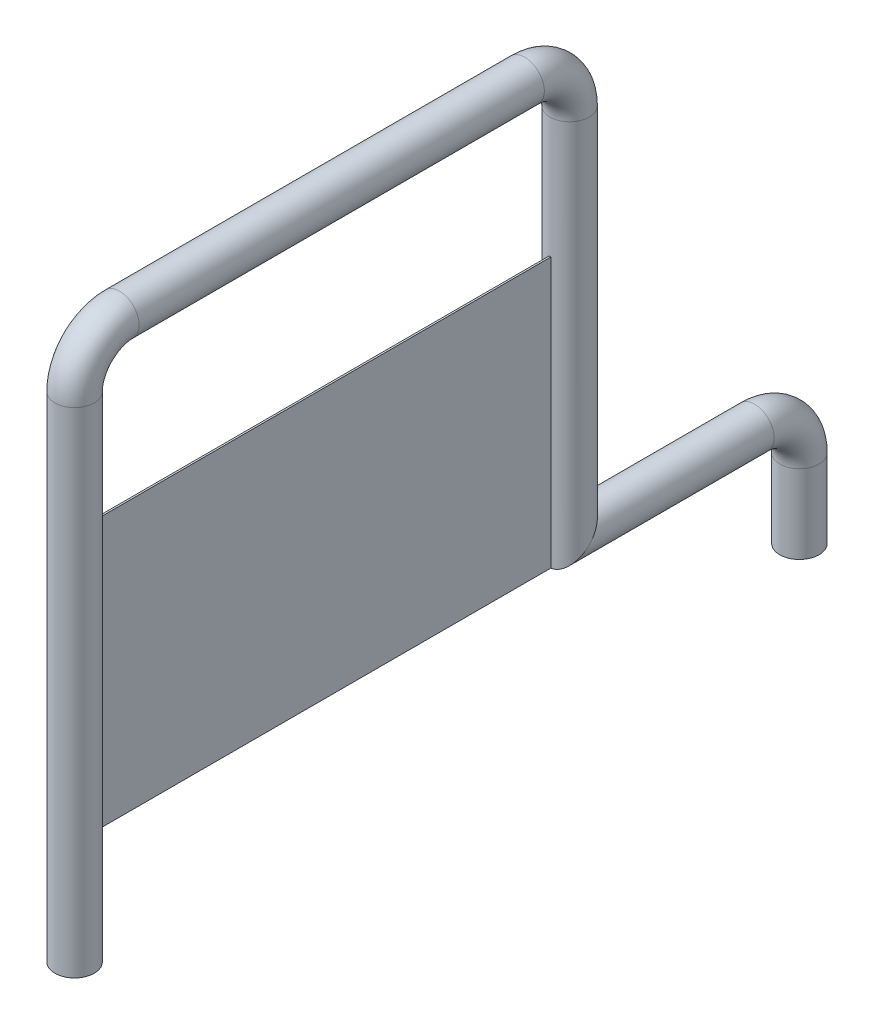
ISO-10303-21;
HEADER;
FILE_DESCRIPTION(('STEP AP214'),'2;1');
FILE_NAME('part.step','',(''),(''),'','','');
FILE_SCHEMA(('AUTOMOTIVE_DESIGN { 1 0 10303 214 1 1 1 1 }'));
ENDSEC;
DATA;
#1=APPLICATION_CONTEXT('core data for automotive mechanical design processes');
#2=APPLICATION_PROTOCOL_DEFINITION('international standard','automotive_design',2000,#1);
#3=PRODUCT_CONTEXT('',#1,'mechanical');
#4=PRODUCT('Part','Part','',(#3));
#5=PRODUCT_RELATED_PRODUCT_CATEGORY('part','',(#4));
#6=PRODUCT_DEFINITION_FORMATION('','',#4);
#7=PRODUCT_DEFINITION_CONTEXT('part definition',#1,'design');
#8=PRODUCT_DEFINITION('design','',#6,#7);
#9=PRODUCT_DEFINITION_SHAPE('','',#8);
#10=(LENGTH_UNIT() NAMED_UNIT(*) SI_UNIT(.MILLI.,.METRE.));
#11=(NAMED_UNIT(*) PLANE_ANGLE_UNIT() SI_UNIT($,.RADIAN.));
#12=(NAMED_UNIT(*) SI_UNIT($,.STERADIAN.) SOLID_ANGLE_UNIT());
#13=UNCERTAINTY_MEASURE_WITH_UNIT(LENGTH_MEASURE(1.E-05),#10,'distance_accuracy_value','');
#14=(GEOMETRIC_REPRESENTATION_CONTEXT(3) GLOBAL_UNCERTAINTY_ASSIGNED_CONTEXT((#13)) GLOBAL_UNIT_ASSIGNED_CONTEXT((#10,
#11,#12)) REPRESENTATION_CONTEXT('',''));
#15=CARTESIAN_POINT('',(0.,0.,0.));
#16=DIRECTION('',(0.,0.,1.));
#17=DIRECTION('',(1.,0.,0.));
#18=AXIS2_PLACEMENT_3D('',#15,#16,#17);
#19=CARTESIAN_POINT('',(-0.508,211.1375,-268.8875));
#20=DIRECTION('',(0.,1.,0.));
#21=DIRECTION('',(0.,0.,1.));
#22=AXIS2_PLACEMENT_3D('',#19,#20,#21);
#23=PLANE('',#22);
#24=DIRECTION('',(1.,0.,0.));
#25=VECTOR('',#24,1.);
#26=CARTESIAN_POINT('',(-0.508,211.1375,-11.1125));
#27=LINE('',#26,#25);
#28=CARTESIAN_POINT('',(-0.508,211.1375,-11.1125));
#29=VERTEX_POINT('',#28);
#30=CARTESIAN_POINT('',(0.508,211.1375,-11.1125));
#31=VERTEX_POINT('',#30);
#32=EDGE_CURVE('E45',#29,#31,#27,.T.);
#33=ORIENTED_EDGE('',*,*,#32,.T.);
#34=DIRECTION('',(0.,0.,1.));
#35=VECTOR('',#34,1.);
#36=CARTESIAN_POINT('',(0.508,211.1375,-268.8875));
#37=LINE('',#36,#35);
#38=CARTESIAN_POINT('',(0.508,211.1375,-268.8875));
#39=VERTEX_POINT('',#38);
#40=EDGE_CURVE('E82',#39,#31,#37,.T.);
#41=ORIENTED_EDGE('',*,*,#40,.F.);
#42=DIRECTION('',(1.,0.,0.));
#43=VECTOR('',#42,1.);
#44=CARTESIAN_POINT('',(-0.508,211.1375,-268.8875));
#45=LINE('',#44,#43);
#46=CARTESIAN_POINT('',(-0.508,211.1375,-268.8875));
#47=VERTEX_POINT('',#46);
#48=EDGE_CURVE('E13',#47,#39,#45,.T.);
#49=ORIENTED_EDGE('',*,*,#48,.F.);
#50=DIRECTION('',(0.,0.,1.));
#51=VECTOR('',#50,1.);
#52=CARTESIAN_POINT('',(-0.508,211.1375,-268.8875));
#53=LINE('',#52,#51);
#54=EDGE_CURVE('E83',#47,#29,#53,.T.);
#55=ORIENTED_EDGE('',*,*,#54,.T.);
#56=EDGE_LOOP('',(#33,#41,#49,#55));
#57=FACE_BOUND('',#56,.T.);
#58=ADVANCED_FACE('F42',(#57),#23,.T.);
#59=CARTESIAN_POINT('',(-0.508,211.1375,-268.8875));
#60=DIRECTION('',(0.,0.,-1.));
#61=DIRECTION('',(0.,1.,0.));
#62=AXIS2_PLACEMENT_3D('',#59,#60,#61);
#63=PLANE('',#62);
#64=ORIENTED_EDGE('',*,*,#48,.T.);
#65=DIRECTION('',(0.,1.,0.));
#66=VECTOR('',#65,1.);
#67=CARTESIAN_POINT('',(0.508,211.1375,-268.8875));
#68=LINE('',#67,#66);
#69=CARTESIAN_POINT('',(0.508,58.7374999999999,-268.8875));
#70=VERTEX_POINT('',#69);
#71=EDGE_CURVE('E99',#70,#39,#68,.T.);
#72=ORIENTED_EDGE('',*,*,#71,.F.);
#73=DIRECTION('',(1.,0.,0.));
#74=VECTOR('',#73,1.);
#75=CARTESIAN_POINT('',(-0.508,58.7374999999999,-268.8875));
#76=LINE('',#75,#74);
#77=CARTESIAN_POINT('',(-0.508,58.7374999999999,-268.8875));
#78=VERTEX_POINT('',#77);
#79=EDGE_CURVE('E50',#78,#70,#76,.T.);
#80=ORIENTED_EDGE('',*,*,#79,.F.);
#81=DIRECTION('',(0.,1.,0.));
#82=VECTOR('',#81,1.);
#83=CARTESIAN_POINT('',(-0.508,211.1375,-268.8875));
#84=LINE('',#83,#82);
#85=EDGE_CURVE('E88',#78,#47,#84,.T.);
#86=ORIENTED_EDGE('',*,*,#85,.T.);
#87=EDGE_LOOP('',(#64,#72,#80,#86));
#88=FACE_BOUND('',#87,.T.);
#89=ADVANCED_FACE('F114',(#88),#63,.T.);
#90=CARTESIAN_POINT('',(-0.508,58.7374999999999,-268.8875));
#91=DIRECTION('',(0.,-1.,0.));
#92=DIRECTION('',(0.,0.,-1.));
#93=AXIS2_PLACEMENT_3D('',#90,#91,#92);
#94=PLANE('',#93);
#95=ORIENTED_EDGE('',*,*,#79,.T.);
#96=DIRECTION('',(0.,0.,-1.));
#97=VECTOR('',#96,1.);
#98=CARTESIAN_POINT('',(0.508,58.7374999999999,-268.8875));
#99=LINE('',#98,#97);
#100=CARTESIAN_POINT('',(0.508,58.7374999999998,-11.1125));
#101=VERTEX_POINT('',#100);
#102=EDGE_CURVE('E95',#101,#70,#99,.T.);
#103=ORIENTED_EDGE('',*,*,#102,.F.);
#104=DIRECTION('',(1.,0.,0.));
#105=VECTOR('',#104,1.);
#106=CARTESIAN_POINT('',(-0.508,58.7374999999998,-11.1125));
#107=LINE('',#106,#105);
#108=CARTESIAN_POINT('',(-0.508,58.7374999999998,-11.1125));
#109=VERTEX_POINT('',#108);
#110=EDGE_CURVE('E87',#109,#101,#107,.T.);
#111=ORIENTED_EDGE('',*,*,#110,.F.);
#112=DIRECTION('',(0.,0.,-1.));
#113=VECTOR('',#112,1.);
#114=CARTESIAN_POINT('',(-0.508,58.7374999999999,-268.8875));
#115=LINE('',#114,#113);
#116=EDGE_CURVE('E107',#109,#78,#115,.T.);
#117=ORIENTED_EDGE('',*,*,#116,.T.);
#118=EDGE_LOOP('',(#95,#103,#111,#117));
#119=FACE_BOUND('',#118,.T.);
#120=ADVANCED_FACE('F111',(#119),#94,.T.);
#121=CARTESIAN_POINT('',(-0.508,211.1375,-11.1125));
#122=DIRECTION('',(0.,0.,1.));
#123=DIRECTION('',(1.,0.,0.));
#124=AXIS2_PLACEMENT_3D('',#121,#122,#123);
#125=PLANE('',#124);
#126=ORIENTED_EDGE('',*,*,#110,.T.);
#127=DIRECTION('',(0.,-1.,0.));
#128=VECTOR('',#127,1.);
#129=CARTESIAN_POINT('',(0.508,211.1375,-11.1125));
#130=LINE('',#129,#128);
#131=EDGE_CURVE('E90',#31,#101,#130,.T.);
#132=ORIENTED_EDGE('',*,*,#131,.F.);
#133=ORIENTED_EDGE('',*,*,#32,.F.);
#134=DIRECTION('',(0.,-1.,0.));
#135=VECTOR('',#134,1.);
#136=CARTESIAN_POINT('',(-0.508,211.1375,-11.1125));
#137=LINE('',#136,#135);
#138=EDGE_CURVE('E105',#29,#109,#137,.T.);
#139=ORIENTED_EDGE('',*,*,#138,.T.);
#140=EDGE_LOOP('',(#126,#132,#133,#139));
#141=FACE_BOUND('',#140,.T.);
#142=ADVANCED_FACE('F91',(#141),#125,.T.);
#143=CARTESIAN_POINT('',(-0.508,211.1375,-11.1125));
#144=DIRECTION('',(1.,0.,0.));
#145=DIRECTION('',(0.,0.,-1.));
#146=AXIS2_PLACEMENT_3D('',#143,#144,#145);
#147=PLANE('',#146);
#148=ORIENTED_EDGE('',*,*,#54,.F.);
#149=ORIENTED_EDGE('',*,*,#85,.F.);
#150=ORIENTED_EDGE('',*,*,#116,.F.);
#151=ORIENTED_EDGE('',*,*,#138,.F.);
#152=EDGE_LOOP('',(#148,#149,#150,#151));
#153=FACE_BOUND('',#152,.T.);
#154=ADVANCED_FACE('F116',(#153),#147,.F.);
#155=CARTESIAN_POINT('',(0.508,211.1375,-11.1125));
#156=DIRECTION('',(1.,0.,0.));
#157=DIRECTION('',(0.,0.,-1.));
#158=AXIS2_PLACEMENT_3D('',#155,#156,#157);
#159=PLANE('',#158);
#160=ORIENTED_EDGE('',*,*,#40,.T.);
#161=ORIENTED_EDGE('',*,*,#131,.T.);
#162=ORIENTED_EDGE('',*,*,#102,.T.);
#163=ORIENTED_EDGE('',*,*,#71,.T.);
#164=EDGE_LOOP('',(#160,#161,#162,#163));
#165=FACE_BOUND('',#164,.T.);
#166=ADVANCED_FACE('F98',(#165),#159,.T.);
#167=CLOSED_SHELL('',(#58,#89,#120,#142,#154,#166));
#168=MANIFOLD_SOLID_BREP('B2',#167);
#169=CARTESIAN_POINT('',(0.,44.4499999999999,-410.));
#170=DIRECTION('',(0.,-1.,0.));
#171=DIRECTION('',(0.,0.,-1.));
#172=AXIS2_PLACEMENT_3D('',#169,#170,#171);
#173=CYLINDRICAL_SURFACE('',#172,11.1125);
#174=CARTESIAN_POINT('',(0.,44.4499999999999,-410.));
#175=DIRECTION('',(0.,-1.,0.));
#176=DIRECTION('',(0.,0.,-1.));
#177=AXIS2_PLACEMENT_3D('',#174,#175,#176);
#178=CIRCLE('',#177,11.1125);
#179=CARTESIAN_POINT('',(0.,44.4499999999999,-421.1125));
#180=VERTEX_POINT('',#179);
#181=EDGE_CURVE('E171',#180,#180,#178,.T.);
#182=ORIENTED_EDGE('',*,*,#181,.T.);
#183=EDGE_LOOP('',(#182));
#184=FACE_BOUND('',#183,.T.);
#185=CARTESIAN_POINT('',(0.,0.,-410.));
#186=DIRECTION('',(0.,-1.,0.));
#187=DIRECTION('',(0.,0.,-1.));
#188=AXIS2_PLACEMENT_3D('',#185,#186,#187);
#189=CIRCLE('',#188,11.1125);
#190=CARTESIAN_POINT('',(0.,0.,-421.1125));
#191=VERTEX_POINT('',#190);
#192=EDGE_CURVE('E41',#191,#191,#189,.T.);
#193=ORIENTED_EDGE('',*,*,#192,.F.);
#194=EDGE_LOOP('',(#193));
#195=FACE_BOUND('',#194,.T.);
#196=ADVANCED_FACE('F165',(#184,#195),#173,.T.);
#197=CARTESIAN_POINT('',(0.,44.4499999999999,-384.6));
#198=DIRECTION('',(-1.,0.,0.));
#199=DIRECTION('',(0.,0.,1.));
#200=AXIS2_PLACEMENT_3D('',#197,#198,#199);
#201=TOROIDAL_SURFACE('',#200,25.4,11.1125);
#202=CARTESIAN_POINT('',(0.,69.8499999999999,-384.6));
#203=DIRECTION('',(0.,0.,-1.));
#204=DIRECTION('',(0.,1.,0.));
#205=AXIS2_PLACEMENT_3D('',#202,#203,#204);
#206=CIRCLE('',#205,11.1125);
#207=CARTESIAN_POINT('',(0.,80.9624999999999,-384.6));
#208=VERTEX_POINT('',#207);
#209=EDGE_CURVE('E175',#208,#208,#206,.T.);
#210=CARTESIAN_POINT('',(0.,44.4499999999999,-384.6));
#211=DIRECTION('',(-1.,0.,0.));
#212=DIRECTION('',(0.,0.,1.));
#213=AXIS2_PLACEMENT_3D('',#210,#211,#212);
#214=CIRCLE('',#213,36.5125);
#215=EDGE_CURVE('',#208,#180,#214,.T.);
#216=ORIENTED_EDGE('',*,*,#209,.T.);
#217=ORIENTED_EDGE('',*,*,#181,.F.);
#218=ORIENTED_EDGE('',*,*,#215,.T.);
#219=ORIENTED_EDGE('',*,*,#215,.F.);
#220=EDGE_LOOP('',(#216,#218,#217,#219));
#221=FACE_BOUND('',#220,.T.);
#222=ADVANCED_FACE('F218',(#221),#201,.T.);
#223=CARTESIAN_POINT('',(0.,69.8499999999999,-280.));
#224=DIRECTION('',(0.,0.,-1.));
#225=DIRECTION('',(-1.,0.,0.));
#226=AXIS2_PLACEMENT_3D('',#223,#224,#225);
#227=CYLINDRICAL_SURFACE('',#226,11.1125);
#228=CARTESIAN_POINT('',(0.,69.8499999999999,-280.));
#229=DIRECTION('',(0.,-0.707106781186548,-0.707106781186548));
#230=DIRECTION('',(0.,-0.707106781186548,0.707106781186548));
#231=AXIS2_PLACEMENT_3D('',#228,#229,#230);
#232=ELLIPSE('',#231,15.715448211871,11.1125);
#233=CARTESIAN_POINT('',(0.,58.7374999999999,-268.8875));
#234=VERTEX_POINT('',#233);
#235=EDGE_CURVE('E179',#234,#234,#232,.F.);
#236=ORIENTED_EDGE('',*,*,#235,.F.);
#237=EDGE_LOOP('',(#236));
#238=FACE_BOUND('',#237,.T.);
#239=ORIENTED_EDGE('',*,*,#209,.F.);
#240=EDGE_LOOP('',(#239));
#241=FACE_BOUND('',#240,.T.);
#242=ADVANCED_FACE('F222',(#238,#241),#227,.T.);
#243=CARTESIAN_POINT('',(0.,279.4,-280.));
#244=DIRECTION('',(0.,-1.,0.));
#245=DIRECTION('',(0.,0.,-1.));
#246=AXIS2_PLACEMENT_3D('',#243,#244,#245);
#247=CYLINDRICAL_SURFACE('',#246,11.1125);
#248=ORIENTED_EDGE('',*,*,#235,.T.);
#249=EDGE_LOOP('',(#248));
#250=FACE_BOUND('',#249,.T.);
#251=CARTESIAN_POINT('',(0.,279.4,-280.));
#252=DIRECTION('',(0.,-1.,0.));
#253=DIRECTION('',(0.,0.,-1.));
#254=AXIS2_PLACEMENT_3D('',#251,#252,#253);
#255=CIRCLE('',#254,11.1125);
#256=CARTESIAN_POINT('',(0.,279.4,-291.1125));
#257=VERTEX_POINT('',#256);
#258=EDGE_CURVE('E184',#257,#257,#255,.T.);
#259=ORIENTED_EDGE('',*,*,#258,.T.);
#260=EDGE_LOOP('',(#259));
#261=FACE_BOUND('',#260,.T.);
#262=ADVANCED_FACE('F228',(#250,#261),#247,.T.);
#263=CARTESIAN_POINT('',(0.,279.4,-254.6));
#264=DIRECTION('',(-1.,0.,0.));
#265=DIRECTION('',(0.,0.,1.));
#266=AXIS2_PLACEMENT_3D('',#263,#264,#265);
#267=TOROIDAL_SURFACE('',#266,25.4,11.1125);
#268=CARTESIAN_POINT('',(0.,304.8,-254.6));
#269=DIRECTION('',(0.,0.,-1.));
#270=DIRECTION('',(0.,1.,0.));
#271=AXIS2_PLACEMENT_3D('',#268,#269,#270);
#272=CIRCLE('',#271,11.1125);
#273=CARTESIAN_POINT('',(0.,315.9125,-254.6));
#274=VERTEX_POINT('',#273);
#275=EDGE_CURVE('E187',#274,#274,#272,.T.);
#276=CARTESIAN_POINT('',(0.,279.4,-254.6));
#277=DIRECTION('',(-1.,0.,0.));
#278=DIRECTION('',(0.,0.,1.));
#279=AXIS2_PLACEMENT_3D('',#276,#277,#278);
#280=CIRCLE('',#279,36.5125);
#281=EDGE_CURVE('',#274,#257,#280,.T.);
#282=ORIENTED_EDGE('',*,*,#275,.T.);
#283=ORIENTED_EDGE('',*,*,#258,.F.);
#284=ORIENTED_EDGE('',*,*,#281,.T.);
#285=ORIENTED_EDGE('',*,*,#281,.F.);
#286=EDGE_LOOP('',(#282,#284,#283,#285));
#287=FACE_BOUND('',#286,.T.);
#288=ADVANCED_FACE('F235',(#287),#267,.T.);
#289=CARTESIAN_POINT('',(0.,304.8,-25.4000000000002));
#290=DIRECTION('',(0.,0.,-1.));
#291=DIRECTION('',(0.,1.,0.));
#292=AXIS2_PLACEMENT_3D('',#289,#290,#291);
#293=CYLINDRICAL_SURFACE('',#292,11.1125);
#294=CARTESIAN_POINT('',(0.,304.8,-25.4000000000002));
#295=DIRECTION('',(0.,0.,-1.));
#296=DIRECTION('',(0.,1.,0.));
#297=AXIS2_PLACEMENT_3D('',#294,#295,#296);
#298=CIRCLE('',#297,11.1125);
#299=CARTESIAN_POINT('',(0.,315.9125,-25.4000000000003));
#300=VERTEX_POINT('',#299);
#301=EDGE_CURVE('E190',#300,#300,#298,.T.);
#302=ORIENTED_EDGE('',*,*,#301,.T.);
#303=EDGE_LOOP('',(#302));
#304=FACE_BOUND('',#303,.T.);
#305=ORIENTED_EDGE('',*,*,#275,.F.);
#306=EDGE_LOOP('',(#305));
#307=FACE_BOUND('',#306,.T.);
#308=ADVANCED_FACE('F239',(#304,#307),#293,.T.);
#309=CARTESIAN_POINT('',(0.,279.4,-25.4));
#310=DIRECTION('',(-1.,0.,0.));
#311=DIRECTION('',(0.,0.,1.));
#312=AXIS2_PLACEMENT_3D('',#309,#310,#311);
#313=TOROIDAL_SURFACE('',#312,25.4,11.1125);
#314=CARTESIAN_POINT('',(0.,279.4,0.));
#315=DIRECTION('',(0.,1.,0.));
#316=DIRECTION('',(0.,0.,1.));
#317=AXIS2_PLACEMENT_3D('',#314,#315,#316);
#318=CIRCLE('',#317,11.1125);
#319=CARTESIAN_POINT('',(0.,279.4,11.1125));
#320=VERTEX_POINT('',#319);
#321=EDGE_CURVE('E193',#320,#320,#318,.T.);
#322=CARTESIAN_POINT('',(0.,279.4,-25.4));
#323=DIRECTION('',(-1.,0.,0.));
#324=DIRECTION('',(0.,0.,1.));
#325=AXIS2_PLACEMENT_3D('',#322,#323,#324);
#326=CIRCLE('',#325,36.5125);
#327=EDGE_CURVE('',#320,#300,#326,.T.);
#328=ORIENTED_EDGE('',*,*,#321,.T.);
#329=ORIENTED_EDGE('',*,*,#301,.F.);
#330=ORIENTED_EDGE('',*,*,#327,.T.);
#331=ORIENTED_EDGE('',*,*,#327,.F.);
#332=EDGE_LOOP('',(#328,#330,#329,#331));
#333=FACE_BOUND('',#332,.T.);
#334=ADVANCED_FACE('F200',(#333),#313,.T.);
#335=CARTESIAN_POINT('',(0.,279.4,0.));
#336=DIRECTION('',(0.,-1.,0.));
#337=DIRECTION('',(0.,0.,-1.));
#338=AXIS2_PLACEMENT_3D('',#335,#336,#337);
#339=CYLINDRICAL_SURFACE('',#338,11.1125);
#340=ORIENTED_EDGE('',*,*,#321,.F.);
#341=EDGE_LOOP('',(#340));
#342=FACE_BOUND('',#341,.T.);
#343=CARTESIAN_POINT('',(0.,0.,0.));
#344=DIRECTION('',(0.,1.,0.));
#345=DIRECTION('',(0.,0.,1.));
#346=AXIS2_PLACEMENT_3D('',#343,#344,#345);
#347=CIRCLE('',#346,11.1125);
#348=CARTESIAN_POINT('',(0.,0.,11.1125));
#349=VERTEX_POINT('',#348);
#350=EDGE_CURVE('E194',#349,#349,#347,.T.);
#351=ORIENTED_EDGE('',*,*,#350,.T.);
#352=EDGE_LOOP('',(#351));
#353=FACE_BOUND('',#352,.T.);
#354=ADVANCED_FACE('F203',(#342,#353),#339,.T.);
#355=CARTESIAN_POINT('',(0.,0.,0.));
#356=DIRECTION('',(0.,1.,0.));
#357=DIRECTION('',(0.,0.,1.));
#358=AXIS2_PLACEMENT_3D('',#355,#356,#357);
#359=PLANE('',#358);
#360=ORIENTED_EDGE('',*,*,#350,.F.);
#361=EDGE_LOOP('',(#360));
#362=FACE_BOUND('',#361,.T.);
#363=ADVANCED_FACE('F206',(#362),#359,.F.);
#364=CARTESIAN_POINT('',(0.,0.,-410.));
#365=DIRECTION('',(0.,-1.,0.));
#366=DIRECTION('',(0.,0.,-1.));
#367=AXIS2_PLACEMENT_3D('',#364,#365,#366);
#368=PLANE('',#367);
#369=ORIENTED_EDGE('',*,*,#192,.T.);
#370=EDGE_LOOP('',(#369));
#371=FACE_BOUND('',#370,.T.);
#372=ADVANCED_FACE('F211',(#371),#368,.T.);
#373=CLOSED_SHELL('',(#196,#222,#242,#262,#288,#308,#334,#354,#363,#372));
#374=MANIFOLD_SOLID_BREP('B7',#373);
#375=ADVANCED_BREP_SHAPE_REPRESENTATION('',(#18,#168,#374),#14);
#376=SHAPE_DEFINITION_REPRESENTATION(#9,#375);
ENDSEC;
END-ISO-10303-21;
